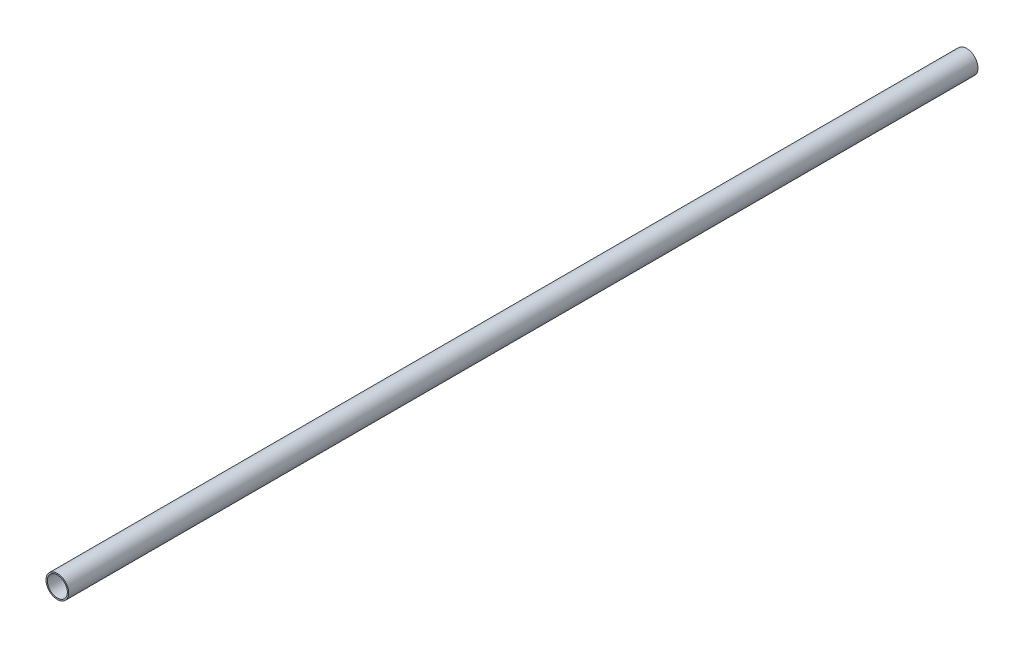
ISO-10303-21;
HEADER;
FILE_DESCRIPTION(('STEP AP214'),'2;1');
FILE_NAME('part.step','',(''),(''),'','','');
FILE_SCHEMA(('AUTOMOTIVE_DESIGN { 1 0 10303 214 1 1 1 1 }'));
ENDSEC;
DATA;
#1=APPLICATION_CONTEXT('core data for automotive mechanical design processes');
#2=APPLICATION_PROTOCOL_DEFINITION('international standard','automotive_design',2000,#1);
#3=PRODUCT_CONTEXT('',#1,'mechanical');
#4=PRODUCT('Part','Part','',(#3));
#5=PRODUCT_RELATED_PRODUCT_CATEGORY('part','',(#4));
#6=PRODUCT_DEFINITION_FORMATION('','',#4);
#7=PRODUCT_DEFINITION_CONTEXT('part definition',#1,'design');
#8=PRODUCT_DEFINITION('design','',#6,#7);
#9=PRODUCT_DEFINITION_SHAPE('','',#8);
#10=(LENGTH_UNIT() NAMED_UNIT(*) SI_UNIT(.MILLI.,.METRE.));
#11=(NAMED_UNIT(*) PLANE_ANGLE_UNIT() SI_UNIT($,.RADIAN.));
#12=(NAMED_UNIT(*) SI_UNIT($,.STERADIAN.) SOLID_ANGLE_UNIT());
#13=UNCERTAINTY_MEASURE_WITH_UNIT(LENGTH_MEASURE(1.E-05),#10,'distance_accuracy_value','');
#14=(GEOMETRIC_REPRESENTATION_CONTEXT(3) GLOBAL_UNCERTAINTY_ASSIGNED_CONTEXT((#13)) GLOBAL_UNIT_ASSIGNED_CONTEXT((#10,
#11,#12)) REPRESENTATION_CONTEXT('',''));
#15=CARTESIAN_POINT('',(0.,0.,0.));
#16=DIRECTION('',(0.,0.,1.));
#17=DIRECTION('',(1.,0.,0.));
#18=AXIS2_PLACEMENT_3D('',#15,#16,#17);
#19=CARTESIAN_POINT('',(0.,0.,-500.));
#20=DIRECTION('',(0.,0.,1.));
#21=DIRECTION('',(1.,0.,0.));
#22=AXIS2_PLACEMENT_3D('',#19,#20,#21);
#23=CYLINDRICAL_SURFACE('',#22,12.5);
#24=CARTESIAN_POINT('',(0.,0.,-500.));
#25=DIRECTION('',(0.,0.,1.));
#26=DIRECTION('',(1.,0.,0.));
#27=AXIS2_PLACEMENT_3D('',#24,#25,#26);
#28=CIRCLE('',#27,12.5);
#29=CARTESIAN_POINT('',(12.5,0.,-500.));
#30=VERTEX_POINT('',#29);
#31=EDGE_CURVE('E10',#30,#30,#28,.T.);
#32=ORIENTED_EDGE('',*,*,#31,.T.);
#33=EDGE_LOOP('',(#32));
#34=FACE_BOUND('',#33,.T.);
#35=CARTESIAN_POINT('',(0.,0.,500.));
#36=DIRECTION('',(0.,0.,1.));
#37=DIRECTION('',(1.,0.,0.));
#38=AXIS2_PLACEMENT_3D('',#35,#36,#37);
#39=CIRCLE('',#38,12.5);
#40=CARTESIAN_POINT('',(12.5,0.,500.));
#41=VERTEX_POINT('',#40);
#42=EDGE_CURVE('E41',#41,#41,#39,.T.);
#43=ORIENTED_EDGE('',*,*,#42,.F.);
#44=EDGE_LOOP('',(#43));
#45=FACE_BOUND('',#44,.T.);
#46=ADVANCED_FACE('F31',(#34,#45),#23,.T.);
#47=CARTESIAN_POINT('',(0.,0.,-500.));
#48=DIRECTION('',(0.,0.,1.));
#49=DIRECTION('',(1.,0.,0.));
#50=AXIS2_PLACEMENT_3D('',#47,#48,#49);
#51=PLANE('',#50);
#52=CARTESIAN_POINT('',(0.,0.,-500.));
#53=DIRECTION('',(0.,0.,1.));
#54=DIRECTION('',(1.,0.,0.));
#55=AXIS2_PLACEMENT_3D('',#52,#53,#54);
#56=CIRCLE('',#55,11.);
#57=CARTESIAN_POINT('',(11.,0.,-500.));
#58=VERTEX_POINT('',#57);
#59=EDGE_CURVE('E37',#58,#58,#56,.T.);
#60=ORIENTED_EDGE('',*,*,#59,.T.);
#61=EDGE_LOOP('',(#60));
#62=FACE_BOUND('',#61,.T.);
#63=ORIENTED_EDGE('',*,*,#31,.F.);
#64=EDGE_LOOP('',(#63));
#65=FACE_BOUND('',#64,.T.);
#66=ADVANCED_FACE('F60',(#62,#65),#51,.F.);
#67=CARTESIAN_POINT('',(0.,0.,-500.));
#68=DIRECTION('',(0.,0.,1.));
#69=DIRECTION('',(1.,0.,0.));
#70=AXIS2_PLACEMENT_3D('',#67,#68,#69);
#71=CYLINDRICAL_SURFACE('',#70,11.);
#72=ORIENTED_EDGE('',*,*,#59,.F.);
#73=EDGE_LOOP('',(#72));
#74=FACE_BOUND('',#73,.T.);
#75=CARTESIAN_POINT('',(0.,0.,500.));
#76=DIRECTION('',(0.,0.,1.));
#77=DIRECTION('',(1.,0.,0.));
#78=AXIS2_PLACEMENT_3D('',#75,#76,#77);
#79=CIRCLE('',#78,11.);
#80=CARTESIAN_POINT('',(11.,0.,500.));
#81=VERTEX_POINT('',#80);
#82=EDGE_CURVE('E45',#81,#81,#79,.T.);
#83=ORIENTED_EDGE('',*,*,#82,.T.);
#84=EDGE_LOOP('',(#83));
#85=FACE_BOUND('',#84,.T.);
#86=ADVANCED_FACE('F51',(#74,#85),#71,.F.);
#87=CARTESIAN_POINT('',(0.,0.,500.));
#88=DIRECTION('',(0.,0.,1.));
#89=DIRECTION('',(1.,0.,0.));
#90=AXIS2_PLACEMENT_3D('',#87,#88,#89);
#91=PLANE('',#90);
#92=ORIENTED_EDGE('',*,*,#42,.T.);
#93=EDGE_LOOP('',(#92));
#94=FACE_BOUND('',#93,.T.);
#95=ORIENTED_EDGE('',*,*,#82,.F.);
#96=EDGE_LOOP('',(#95));
#97=FACE_BOUND('',#96,.T.);
#98=ADVANCED_FACE('F53',(#94,#97),#91,.T.);
#99=CLOSED_SHELL('',(#46,#66,#86,#98));
#100=MANIFOLD_SOLID_BREP('B2',#99);
#101=ADVANCED_BREP_SHAPE_REPRESENTATION('',(#18,#100),#14);
#102=SHAPE_DEFINITION_REPRESENTATION(#9,#101);
ENDSEC;
END-ISO-10303-21;
